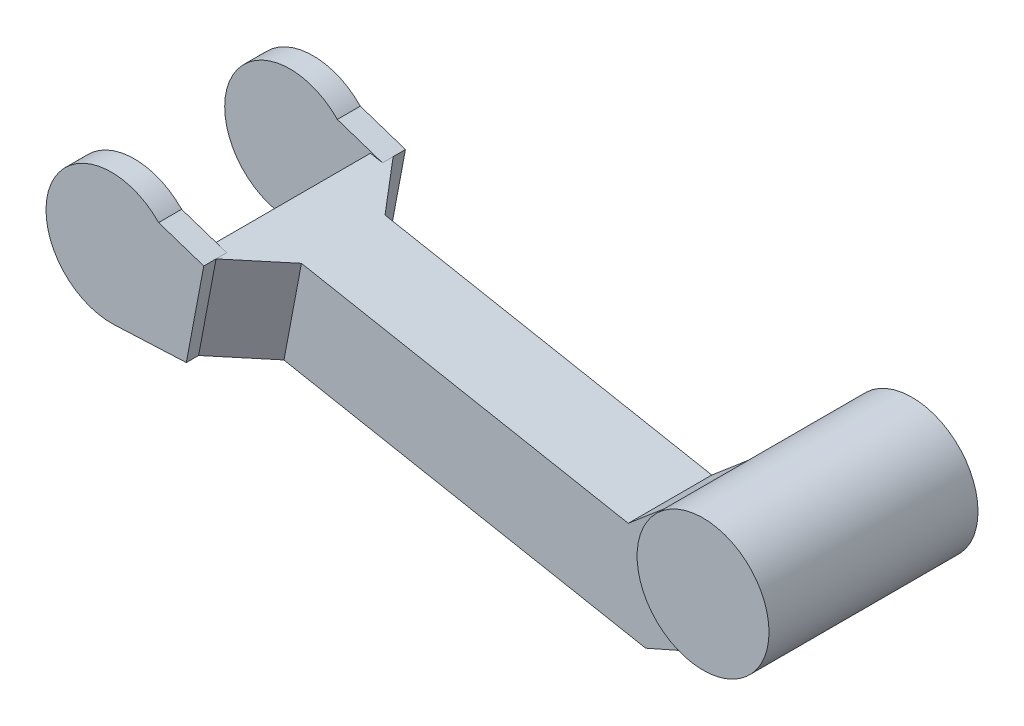
ISO-10303-21;
HEADER;
FILE_DESCRIPTION(('STEP AP214'),'2;1');
FILE_NAME('part.step','',(''),(''),'','','');
FILE_SCHEMA(('AUTOMOTIVE_DESIGN { 1 0 10303 214 1 1 1 1 }'));
ENDSEC;
DATA;
#1=APPLICATION_CONTEXT('core data for automotive mechanical design processes');
#2=APPLICATION_PROTOCOL_DEFINITION('international standard','automotive_design',2000,#1);
#3=PRODUCT_CONTEXT('',#1,'mechanical');
#4=PRODUCT('Part','Part','',(#3));
#5=PRODUCT_RELATED_PRODUCT_CATEGORY('part','',(#4));
#6=PRODUCT_DEFINITION_FORMATION('','',#4);
#7=PRODUCT_DEFINITION_CONTEXT('part definition',#1,'design');
#8=PRODUCT_DEFINITION('design','',#6,#7);
#9=PRODUCT_DEFINITION_SHAPE('','',#8);
#10=(LENGTH_UNIT() NAMED_UNIT(*) SI_UNIT(.MILLI.,.METRE.));
#11=(NAMED_UNIT(*) PLANE_ANGLE_UNIT() SI_UNIT($,.RADIAN.));
#12=(NAMED_UNIT(*) SI_UNIT($,.STERADIAN.) SOLID_ANGLE_UNIT());
#13=UNCERTAINTY_MEASURE_WITH_UNIT(LENGTH_MEASURE(1.E-05),#10,'distance_accuracy_value','');
#14=(GEOMETRIC_REPRESENTATION_CONTEXT(3) GLOBAL_UNCERTAINTY_ASSIGNED_CONTEXT((#13)) GLOBAL_UNIT_ASSIGNED_CONTEXT((#10,
#11,#12)) REPRESENTATION_CONTEXT('',''));
#15=CARTESIAN_POINT('',(0.,0.,0.));
#16=DIRECTION('',(0.,0.,1.));
#17=DIRECTION('',(1.,0.,0.));
#18=AXIS2_PLACEMENT_3D('',#15,#16,#17);
#19=CARTESIAN_POINT('',(0.219275504350662,-0.0185701753944159,-0.02));
#20=DIRECTION('',(0.185665007156138,0.982613100420359,0.));
#21=DIRECTION('',(-0.982613100420359,0.185665007156138,0.));
#22=AXIS2_PLACEMENT_3D('',#19,#20,#21);
#23=PLANE('',#22);
#24=DIRECTION('',(0.,0.,1.));
#25=VECTOR('',#24,1.);
#26=CARTESIAN_POINT('',(0.0441830210359381,0.0145135959838684,-0.0485));
#27=LINE('',#26,#25);
#28=CARTESIAN_POINT('',(0.0441830210359381,0.0145135959838684,-0.0425959256360464));
#29=VERTEX_POINT('',#28);
#30=CARTESIAN_POINT('',(0.0441830210359381,0.0145135959838684,-0.0375));
#31=VERTEX_POINT('',#30);
#32=EDGE_CURVE('E228',#29,#31,#27,.T.);
#33=ORIENTED_EDGE('',*,*,#32,.T.);
#34=DIRECTION('',(0.982613100420359,-0.185665007156138,0.));
#35=VECTOR('',#34,1.);
#36=CARTESIAN_POINT('',(0.219275504350662,-0.0185701753944159,-0.0375));
#37=LINE('',#36,#35);
#38=CARTESIAN_POINT('',(0.0384360985953204,0.0155994785103752,-0.0375));
#39=VERTEX_POINT('',#38);
#40=EDGE_CURVE('E231',#39,#31,#37,.T.);
#41=ORIENTED_EDGE('',*,*,#40,.F.);
#42=DIRECTION('',(0.,0.,1.));
#43=VECTOR('',#42,1.);
#44=CARTESIAN_POINT('',(0.0384360985953204,0.0155994785103752,-0.0425959256360464));
#45=LINE('',#44,#43);
#46=CARTESIAN_POINT('',(0.0384360985953207,0.0155994785103751,0.037));
#47=VERTEX_POINT('',#46);
#48=EDGE_CURVE('E62',#39,#47,#45,.T.);
#49=ORIENTED_EDGE('',*,*,#48,.T.);
#50=DIRECTION('',(0.982613100420359,-0.185665007156138,0.));
#51=VECTOR('',#50,1.);
#52=CARTESIAN_POINT('',(0.219275504350662,-0.0185701753944159,0.037));
#53=LINE('',#52,#51);
#54=CARTESIAN_POINT('',(0.0441830210359381,0.0145135959838684,0.037));
#55=VERTEX_POINT('',#54);
#56=EDGE_CURVE('E266',#47,#55,#53,.T.);
#57=ORIENTED_EDGE('',*,*,#56,.T.);
#58=DIRECTION('',(0.,0.,-1.));
#59=VECTOR('',#58,1.);
#60=CARTESIAN_POINT('',(0.0441830210359381,0.0145135959838684,0.048));
#61=LINE('',#60,#59);
#62=CARTESIAN_POINT('',(0.0441830210359381,0.0145135959838684,0.0421205313982931));
#63=VERTEX_POINT('',#62);
#64=EDGE_CURVE('E253',#63,#55,#61,.T.);
#65=ORIENTED_EDGE('',*,*,#64,.F.);
#66=DIRECTION('',(0.641493073190613,-0.12121028711463,-0.757492378407897));
#67=VECTOR('',#66,1.);
#68=CARTESIAN_POINT('',(0.0441830210359381,0.0145135959838684,0.0421205313982931));
#69=LINE('',#68,#67);
#70=CARTESIAN_POINT('',(0.062916104129296,0.010973974941673,0.02));
#71=VERTEX_POINT('',#70);
#72=EDGE_CURVE('E279',#63,#71,#69,.T.);
#73=ORIENTED_EDGE('',*,*,#72,.T.);
#74=DIRECTION('',(-0.982613100420359,0.185665007156138,0.));
#75=VECTOR('',#74,1.);
#76=CARTESIAN_POINT('',(0.219275504350662,-0.0185701753944159,0.02));
#77=LINE('',#76,#75);
#78=CARTESIAN_POINT('',(0.219275504350662,-0.0185701753944159,0.02));
#79=VERTEX_POINT('',#78);
#80=EDGE_CURVE('E305',#79,#71,#77,.T.);
#81=ORIENTED_EDGE('',*,*,#80,.F.);
#82=DIRECTION('',(0.,0.,1.));
#83=VECTOR('',#82,1.);
#84=CARTESIAN_POINT('',(0.219275504350662,-0.0185701753944159,-0.02));
#85=LINE('',#84,#83);
#86=CARTESIAN_POINT('',(0.219275504350662,-0.0185701753944159,-0.02));
#87=VERTEX_POINT('',#86);
#88=EDGE_CURVE('E346',#87,#79,#85,.T.);
#89=ORIENTED_EDGE('',*,*,#88,.F.);
#90=DIRECTION('',(-0.982613100420359,0.185665007156138,0.));
#91=VECTOR('',#90,1.);
#92=CARTESIAN_POINT('',(0.219275504350662,-0.0185701753944159,-0.02));
#93=LINE('',#92,#91);
#94=CARTESIAN_POINT('',(0.062916104129296,0.010973974941673,-0.02));
#95=VERTEX_POINT('',#94);
#96=EDGE_CURVE('E320',#87,#95,#93,.T.);
#97=ORIENTED_EDGE('',*,*,#96,.T.);
#98=DIRECTION('',(-0.633643962286851,0.119727195517853,-0.764304080658248));
#99=VECTOR('',#98,1.);
#100=CARTESIAN_POINT('',(0.062916104129296,0.010973974941673,-0.02));
#101=LINE('',#100,#99);
#102=EDGE_CURVE('E282',#95,#29,#101,.T.);
#103=ORIENTED_EDGE('',*,*,#102,.T.);
#104=EDGE_LOOP('',(#33,#41,#49,#57,#65,#73,#81,#89,#97,#103));
#105=FACE_BOUND('',#104,.T.);
#106=ADVANCED_FACE('F39',(#105),#23,.T.);
#107=CARTESIAN_POINT('',(-0.00418405553912482,-0.0221436868939603,0.));
#108=DIRECTION('',(0.185665007156138,0.982613100420359,0.));
#109=DIRECTION('',(-0.982613100420359,0.185665007156138,0.));
#110=AXIS2_PLACEMENT_3D('',#107,#108,#109);
#111=PLANE('',#110);
#112=DIRECTION('',(0.,0.,-1.));
#113=VECTOR('',#112,1.);
#114=CARTESIAN_POINT('',(0.0358280957139119,-0.0297039935350477,0.048));
#115=LINE('',#114,#113);
#116=CARTESIAN_POINT('',(0.0358280957139119,-0.0297039935350477,0.0421205313982931));
#117=VERTEX_POINT('',#116);
#118=CARTESIAN_POINT('',(0.0358280957139119,-0.0297039935350477,0.037));
#119=VERTEX_POINT('',#118);
#120=EDGE_CURVE('E257',#117,#119,#115,.T.);
#121=ORIENTED_EDGE('',*,*,#120,.T.);
#122=DIRECTION('',(0.982613100420359,-0.185665007156138,0.));
#123=VECTOR('',#122,1.);
#124=CARTESIAN_POINT('',(-0.00418405553912482,-0.0221436868939603,0.037));
#125=LINE('',#124,#123);
#126=CARTESIAN_POINT('',(0.0300811732732945,-0.0286181110085411,0.037));
#127=VERTEX_POINT('',#126);
#128=EDGE_CURVE('E264',#127,#119,#125,.T.);
#129=ORIENTED_EDGE('',*,*,#128,.F.);
#130=DIRECTION('',(0.,0.,1.));
#131=VECTOR('',#130,1.);
#132=CARTESIAN_POINT('',(0.0300811732732942,-0.028618111008541,-0.0425959256360464));
#133=LINE('',#132,#131);
#134=CARTESIAN_POINT('',(0.0300811732732942,-0.028618111008541,0.02));
#135=VERTEX_POINT('',#134);
#136=EDGE_CURVE('E271',#135,#127,#133,.T.);
#137=ORIENTED_EDGE('',*,*,#136,.F.);
#138=DIRECTION('',(0.982613100420359,-0.185665007156138,0.));
#139=VECTOR('',#138,1.);
#140=CARTESIAN_POINT('',(-0.00418405553912483,-0.0221436868939603,0.02));
#141=LINE('',#140,#139);
#142=CARTESIAN_POINT('',(0.0545611788072698,-0.0332436145772432,0.02));
#143=VERTEX_POINT('',#142);
#144=EDGE_CURVE('E360',#135,#143,#141,.T.);
#145=ORIENTED_EDGE('',*,*,#144,.T.);
#146=DIRECTION('',(0.641493073190613,-0.12121028711463,-0.757492378407897));
#147=VECTOR('',#146,1.);
#148=CARTESIAN_POINT('',(0.0358280957139119,-0.0297039935350477,0.0421205313982931));
#149=LINE('',#148,#147);
#150=EDGE_CURVE('E270',#117,#143,#149,.T.);
#151=ORIENTED_EDGE('',*,*,#150,.F.);
#152=EDGE_LOOP('',(#121,#129,#137,#145,#151));
#153=FACE_BOUND('',#152,.T.);
#154=ADVANCED_FACE('F387',(#153),#111,.F.);
#155=CARTESIAN_POINT('',(0.0300811732732942,-0.028618111008541,-0.0425959256360464));
#156=DIRECTION('',(-0.982613100420359,0.185665007156138,0.));
#157=DIRECTION('',(-0.185665007156138,-0.982613100420359,0.));
#158=AXIS2_PLACEMENT_3D('',#155,#156,#157);
#159=PLANE('',#158);
#160=DIRECTION('',(0.185665007156138,0.982613100420359,0.));
#161=VECTOR('',#160,1.);
#162=CARTESIAN_POINT('',(0.0300811732732942,-0.028618111008541,-0.0375));
#163=LINE('',#162,#161);
#164=CARTESIAN_POINT('',(0.0300811732732942,-0.028618111008541,-0.0375));
#165=VERTEX_POINT('',#164);
#166=EDGE_CURVE('E224',#165,#39,#163,.T.);
#167=ORIENTED_EDGE('',*,*,#166,.F.);
#168=CARTESIAN_POINT('',(0.0300811732732942,-0.028618111008541,-0.02));
#169=VERTEX_POINT('',#168);
#170=EDGE_CURVE('E268',#165,#169,#133,.T.);
#171=ORIENTED_EDGE('',*,*,#170,.T.);
#172=DIRECTION('',(0.185665007156138,0.982613100420359,0.));
#173=VECTOR('',#172,1.);
#174=CARTESIAN_POINT('',(0.0342652288124191,-0.00647442411458072,-0.02));
#175=LINE('',#174,#173);
#176=CARTESIAN_POINT('',(0.0347334988010987,-0.00399615299360829,-0.02));
#177=VERTEX_POINT('',#176);
#178=EDGE_CURVE('E299',#169,#177,#175,.T.);
#179=ORIENTED_EDGE('',*,*,#178,.T.);
#180=DIRECTION('',(0.,1.16305100130705E-13,1.));
#181=VECTOR('',#180,1.);
#182=CARTESIAN_POINT('',(0.0347334988010973,-0.00399615299361515,-0.0199999999999976));
#183=LINE('',#182,#181);
#184=CARTESIAN_POINT('',(0.0347334988011004,-0.00399615299360026,0.02));
#185=VERTEX_POINT('',#184);
#186=EDGE_CURVE('E296',#177,#185,#183,.T.);
#187=ORIENTED_EDGE('',*,*,#186,.T.);
#188=DIRECTION('',(0.185665007156138,0.982613100420359,0.));
#189=VECTOR('',#188,1.);
#190=CARTESIAN_POINT('',(0.0342652288124192,-0.00647442411458075,0.02));
#191=LINE('',#190,#189);
#192=EDGE_CURVE('E363',#135,#185,#191,.T.);
#193=ORIENTED_EDGE('',*,*,#192,.F.);
#194=ORIENTED_EDGE('',*,*,#136,.T.);
#195=DIRECTION('',(0.185665007156138,0.982613100420359,0.));
#196=VECTOR('',#195,1.);
#197=CARTESIAN_POINT('',(0.0300811732732945,-0.0286181110085411,0.037));
#198=LINE('',#197,#196);
#199=EDGE_CURVE('E365',#127,#47,#198,.T.);
#200=ORIENTED_EDGE('',*,*,#199,.T.);
#201=ORIENTED_EDGE('',*,*,#48,.F.);
#202=EDGE_LOOP('',(#167,#171,#179,#187,#193,#194,#200,#201));
#203=FACE_BOUND('',#202,.T.);
#204=ADVANCED_FACE('F376',(#203),#159,.T.);
#205=CARTESIAN_POINT('',(0.285082824963195,0.,-0.05));
#206=DIRECTION('',(0.,0.,1.));
#207=DIRECTION('',(1.,0.,0.));
#208=AXIS2_PLACEMENT_3D('',#205,#206,#207);
#209=CYLINDRICAL_SURFACE('',#208,0.03155548500995);
#210=CARTESIAN_POINT('',(0.285082824963195,0.,-0.02));
#211=DIRECTION('',(0.,0.,-1.));
#212=DIRECTION('',(-1.,0.,0.));
#213=AXIS2_PLACEMENT_3D('',#210,#211,#212);
#214=CIRCLE('',#213,0.03155548500995);
#215=CARTESIAN_POINT('',(0.256264100734639,0.0128541731765059,-0.02));
#216=VERTEX_POINT('',#215);
#217=CARTESIAN_POINT('',(0.305214711775595,-0.0242992956191301,-0.02));
#218=VERTEX_POINT('',#217);
#219=EDGE_CURVE('E358',#216,#218,#214,.F.);
#220=ORIENTED_EDGE('',*,*,#219,.F.);
#221=DIRECTION('',(0.,0.,1.));
#222=VECTOR('',#221,1.);
#223=CARTESIAN_POINT('',(0.256264100734639,0.0128541731765059,-0.02));
#224=LINE('',#223,#222);
#225=CARTESIAN_POINT('',(0.256264100734639,0.0128541731765059,0.02));
#226=VERTEX_POINT('',#225);
#227=EDGE_CURVE('E334',#216,#226,#224,.T.);
#228=ORIENTED_EDGE('',*,*,#227,.T.);
#229=CARTESIAN_POINT('',(0.285082824963195,0.,0.02));
#230=DIRECTION('',(0.,0.,-1.));
#231=DIRECTION('',(-1.,0.,0.));
#232=AXIS2_PLACEMENT_3D('',#229,#230,#231);
#233=CIRCLE('',#232,0.03155548500995);
#234=CARTESIAN_POINT('',(0.305214711775595,-0.0242992956191301,0.02));
#235=VERTEX_POINT('',#234);
#236=EDGE_CURVE('E355',#226,#235,#233,.F.);
#237=ORIENTED_EDGE('',*,*,#236,.T.);
#238=DIRECTION('',(0.,0.,1.));
#239=VECTOR('',#238,1.);
#240=CARTESIAN_POINT('',(0.305214711775595,-0.0242992956191301,-0.02));
#241=LINE('',#240,#239);
#242=EDGE_CURVE('E335',#218,#235,#241,.T.);
#243=ORIENTED_EDGE('',*,*,#242,.F.);
#244=EDGE_LOOP('',(#220,#228,#237,#243));
#245=FACE_BOUND('',#244,.T.);
#246=CARTESIAN_POINT('',(0.285082824963195,0.,-0.05));
#247=DIRECTION('',(0.,0.,1.));
#248=DIRECTION('',(1.,0.,0.));
#249=AXIS2_PLACEMENT_3D('',#246,#247,#248);
#250=CIRCLE('',#249,0.03155548500995);
#251=CARTESIAN_POINT('',(0.316638309973145,0.,-0.05));
#252=VERTEX_POINT('',#251);
#253=EDGE_CURVE('E352',#252,#252,#250,.T.);
#254=ORIENTED_EDGE('',*,*,#253,.T.);
#255=EDGE_LOOP('',(#254));
#256=FACE_BOUND('',#255,.T.);
#257=CARTESIAN_POINT('',(0.285082824963195,0.,0.05));
#258=DIRECTION('',(0.,0.,1.));
#259=DIRECTION('',(1.,0.,0.));
#260=AXIS2_PLACEMENT_3D('',#257,#258,#259);
#261=CIRCLE('',#260,0.03155548500995);
#262=CARTESIAN_POINT('',(0.316638309973145,0.,0.05));
#263=VERTEX_POINT('',#262);
#264=EDGE_CURVE('E338',#263,#263,#261,.T.);
#265=ORIENTED_EDGE('',*,*,#264,.F.);
#266=EDGE_LOOP('',(#265));
#267=FACE_BOUND('',#266,.T.);
#268=ADVANCED_FACE('F41',(#245,#256,#267),#209,.T.);
#269=CARTESIAN_POINT('',(0.285082824963195,0.,-0.05));
#270=DIRECTION('',(0.,0.,1.));
#271=DIRECTION('',(1.,0.,0.));
#272=AXIS2_PLACEMENT_3D('',#269,#270,#271);
#273=PLANE('',#272);
#274=ORIENTED_EDGE('',*,*,#253,.F.);
#275=EDGE_LOOP('',(#274));
#276=FACE_BOUND('',#275,.T.);
#277=ADVANCED_FACE('F442',(#276),#273,.F.);
#278=CARTESIAN_POINT('',(0.285082824963195,0.,0.05));
#279=DIRECTION('',(0.,0.,1.));
#280=DIRECTION('',(1.,0.,0.));
#281=AXIS2_PLACEMENT_3D('',#278,#279,#280);
#282=PLANE('',#281);
#283=ORIENTED_EDGE('',*,*,#264,.T.);
#284=EDGE_LOOP('',(#283));
#285=FACE_BOUND('',#284,.T.);
#286=ADVANCED_FACE('F439',(#285),#282,.T.);
#287=CARTESIAN_POINT('',(0.289916370198147,-0.0386472936572409,-0.02));
#288=DIRECTION('',(0.684088364534501,-0.729399142793924,0.));
#289=DIRECTION('',(0.729399142793924,0.684088364534501,0.));
#290=AXIS2_PLACEMENT_3D('',#287,#288,#289);
#291=PLANE('',#290);
#292=ORIENTED_EDGE('',*,*,#242,.T.);
#293=DIRECTION('',(0.729399142793924,0.684088364534501,0.));
#294=VECTOR('',#293,1.);
#295=CARTESIAN_POINT('',(0.289916370198147,-0.0386472936572409,0.02));
#296=LINE('',#295,#294);
#297=CARTESIAN_POINT('',(0.289916370198147,-0.0386472936572409,0.02));
#298=VERTEX_POINT('',#297);
#299=EDGE_CURVE('E315',#298,#235,#296,.T.);
#300=ORIENTED_EDGE('',*,*,#299,.F.);
#301=DIRECTION('',(0.,0.,1.));
#302=VECTOR('',#301,1.);
#303=CARTESIAN_POINT('',(0.289916370198147,-0.0386472936572409,-0.02));
#304=LINE('',#303,#302);
#305=CARTESIAN_POINT('',(0.289916370198147,-0.0386472936572409,-0.02));
#306=VERTEX_POINT('',#305);
#307=EDGE_CURVE('E339',#306,#298,#304,.T.);
#308=ORIENTED_EDGE('',*,*,#307,.F.);
#309=DIRECTION('',(0.729399142793924,0.684088364534501,0.));
#310=VECTOR('',#309,1.);
#311=CARTESIAN_POINT('',(0.289916370198147,-0.0386472936572409,-0.02));
#312=LINE('',#311,#310);
#313=EDGE_CURVE('E331',#306,#218,#312,.T.);
#314=ORIENTED_EDGE('',*,*,#313,.T.);
#315=EDGE_LOOP('',(#292,#300,#308,#314));
#316=FACE_BOUND('',#315,.T.);
#317=ADVANCED_FACE('F441',(#316),#291,.T.);
#318=CARTESIAN_POINT('',(0.227597753311921,-0.0661558631230026,-0.02));
#319=DIRECTION('',(0.403825283971737,-0.914836127415804,0.));
#320=DIRECTION('',(0.914836127415805,0.403825283971737,0.));
#321=AXIS2_PLACEMENT_3D('',#318,#319,#320);
#322=PLANE('',#321);
#323=ORIENTED_EDGE('',*,*,#307,.T.);
#324=DIRECTION('',(0.914836127415804,0.403825283971737,0.));
#325=VECTOR('',#324,1.);
#326=CARTESIAN_POINT('',(0.227597753311921,-0.0661558631230026,0.02));
#327=LINE('',#326,#325);
#328=CARTESIAN_POINT('',(0.227597753311921,-0.0661558631230026,0.02));
#329=VERTEX_POINT('',#328);
#330=EDGE_CURVE('E312',#329,#298,#327,.T.);
#331=ORIENTED_EDGE('',*,*,#330,.F.);
#332=DIRECTION('',(0.,0.,1.));
#333=VECTOR('',#332,1.);
#334=CARTESIAN_POINT('',(0.227597753311921,-0.0661558631230026,-0.02));
#335=LINE('',#334,#333);
#336=CARTESIAN_POINT('',(0.227597753311921,-0.0661558631230026,-0.02));
#337=VERTEX_POINT('',#336);
#338=EDGE_CURVE('E341',#337,#329,#335,.T.);
#339=ORIENTED_EDGE('',*,*,#338,.F.);
#340=DIRECTION('',(0.914836127415804,0.403825283971737,0.));
#341=VECTOR('',#340,1.);
#342=CARTESIAN_POINT('',(0.227597753311921,-0.0661558631230026,-0.02));
#343=LINE('',#342,#341);
#344=EDGE_CURVE('E328',#337,#306,#343,.T.);
#345=ORIENTED_EDGE('',*,*,#344,.T.);
#346=EDGE_LOOP('',(#323,#331,#339,#345));
#347=FACE_BOUND('',#346,.T.);
#348=ADVANCED_FACE('F469',(#347),#322,.T.);
#349=CARTESIAN_POINT('',(0.0293620855256194,-0.0285371730406325,-0.02));
#350=DIRECTION('',(-0.186440190809526,-0.982466312527258,0.));
#351=DIRECTION('',(0.982466312527258,-0.186440190809526,0.));
#352=AXIS2_PLACEMENT_3D('',#349,#350,#351);
#353=PLANE('',#352);
#354=ORIENTED_EDGE('',*,*,#338,.T.);
#355=DIRECTION('',(0.982466312527258,-0.186440190809526,0.));
#356=VECTOR('',#355,1.);
#357=CARTESIAN_POINT('',(0.0293620855256194,-0.0285371730406325,0.02));
#358=LINE('',#357,#356);
#359=CARTESIAN_POINT('',(0.0293620855256194,-0.0285371730406325,0.02));
#360=VERTEX_POINT('',#359);
#361=EDGE_CURVE('E309',#360,#329,#358,.T.);
#362=ORIENTED_EDGE('',*,*,#361,.F.);
#363=DIRECTION('',(0.,0.,1.));
#364=VECTOR('',#363,1.);
#365=CARTESIAN_POINT('',(0.0293620855256194,-0.0285371730406325,-0.02));
#366=LINE('',#365,#364);
#367=CARTESIAN_POINT('',(0.0293620855256194,-0.0285371730406325,-0.02));
#368=VERTEX_POINT('',#367);
#369=EDGE_CURVE('E343',#368,#360,#366,.T.);
#370=ORIENTED_EDGE('',*,*,#369,.F.);
#371=DIRECTION('',(0.982466312527258,-0.186440190809526,0.));
#372=VECTOR('',#371,1.);
#373=CARTESIAN_POINT('',(0.0293620855256194,-0.0285371730406325,-0.02));
#374=LINE('',#373,#372);
#375=EDGE_CURVE('E325',#368,#337,#374,.T.);
#376=ORIENTED_EDGE('',*,*,#375,.T.);
#377=EDGE_LOOP('',(#354,#362,#370,#376));
#378=FACE_BOUND('',#377,.T.);
#379=ADVANCED_FACE('F474',(#378),#353,.T.);
#380=CARTESIAN_POINT('',(0.0389992026637032,0.0154930798466069,-0.02));
#381=DIRECTION('',(-0.976874539525971,0.213813315829304,0.));
#382=DIRECTION('',(-0.213813315829304,-0.976874539525971,0.));
#383=AXIS2_PLACEMENT_3D('',#380,#381,#382);
#384=PLANE('',#383);
#385=ORIENTED_EDGE('',*,*,#186,.F.);
#386=DIRECTION('',(-0.213813315829304,-0.976874539525971,0.));
#387=VECTOR('',#386,1.);
#388=CARTESIAN_POINT('',(0.0389992026637032,0.0154930798466069,-0.02));
#389=LINE('',#388,#387);
#390=EDGE_CURVE('E323',#177,#368,#389,.T.);
#391=ORIENTED_EDGE('',*,*,#390,.T.);
#392=ORIENTED_EDGE('',*,*,#369,.T.);
#393=DIRECTION('',(-0.213813315829304,-0.976874539525971,0.));
#394=VECTOR('',#393,1.);
#395=CARTESIAN_POINT('',(0.0389992026637032,0.0154930798466069,0.02));
#396=LINE('',#395,#394);
#397=EDGE_CURVE('E307',#185,#360,#396,.T.);
#398=ORIENTED_EDGE('',*,*,#397,.F.);
#399=EDGE_LOOP('',(#385,#391,#392,#398));
#400=FACE_BOUND('',#399,.T.);
#401=ADVANCED_FACE('F432',(#400),#384,.T.);
#402=CARTESIAN_POINT('',(0.256264100734639,0.0128541731765059,-0.02));
#403=DIRECTION('',(-0.647457513851139,0.762101546880533,0.));
#404=DIRECTION('',(-0.762101546880533,-0.647457513851139,0.));
#405=AXIS2_PLACEMENT_3D('',#402,#403,#404);
#406=PLANE('',#405);
#407=ORIENTED_EDGE('',*,*,#88,.T.);
#408=DIRECTION('',(-0.762101546880533,-0.647457513851139,0.));
#409=VECTOR('',#408,1.);
#410=CARTESIAN_POINT('',(0.256264100734639,0.0128541731765059,0.02));
#411=LINE('',#410,#409);
#412=EDGE_CURVE('E302',#226,#79,#411,.T.);
#413=ORIENTED_EDGE('',*,*,#412,.F.);
#414=ORIENTED_EDGE('',*,*,#227,.F.);
#415=DIRECTION('',(-0.762101546880533,-0.647457513851139,0.));
#416=VECTOR('',#415,1.);
#417=CARTESIAN_POINT('',(0.256264100734639,0.0128541731765059,-0.02));
#418=LINE('',#417,#416);
#419=EDGE_CURVE('E317',#216,#87,#418,.T.);
#420=ORIENTED_EDGE('',*,*,#419,.T.);
#421=EDGE_LOOP('',(#407,#413,#414,#420));
#422=FACE_BOUND('',#421,.T.);
#423=ADVANCED_FACE('F434',(#422),#406,.T.);
#424=CARTESIAN_POINT('',(0.,0.,-0.02));
#425=DIRECTION('',(0.,0.,-1.));
#426=DIRECTION('',(-1.,0.,0.));
#427=AXIS2_PLACEMENT_3D('',#424,#425,#426);
#428=PLANE('',#427);
#429=DIRECTION('',(0.185665007156138,0.982613100420359,0.));
#430=VECTOR('',#429,1.);
#431=CARTESIAN_POINT('',(0.0545611788072698,-0.0332436145772432,-0.02));
#432=LINE('',#431,#430);
#433=CARTESIAN_POINT('',(0.0545611788072698,-0.0332436145772432,-0.02));
#434=VERTEX_POINT('',#433);
#435=EDGE_CURVE('E289',#434,#95,#432,.T.);
#436=ORIENTED_EDGE('',*,*,#435,.T.);
#437=ORIENTED_EDGE('',*,*,#96,.F.);
#438=ORIENTED_EDGE('',*,*,#419,.F.);
#439=ORIENTED_EDGE('',*,*,#219,.T.);
#440=ORIENTED_EDGE('',*,*,#313,.F.);
#441=ORIENTED_EDGE('',*,*,#344,.F.);
#442=ORIENTED_EDGE('',*,*,#375,.F.);
#443=ORIENTED_EDGE('',*,*,#390,.F.);
#444=ORIENTED_EDGE('',*,*,#178,.F.);
#445=DIRECTION('',(0.982613100420359,-0.185665007156138,0.));
#446=VECTOR('',#445,1.);
#447=CARTESIAN_POINT('',(-0.00418405553912483,-0.0221436868939603,-0.02));
#448=LINE('',#447,#446);
#449=EDGE_CURVE('E288',#169,#434,#448,.T.);
#450=ORIENTED_EDGE('',*,*,#449,.T.);
#451=EDGE_LOOP('',(#436,#437,#438,#439,#440,#441,#442,#443,#444,#450));
#452=FACE_BOUND('',#451,.T.);
#453=ADVANCED_FACE('F437',(#452),#428,.T.);
#454=CARTESIAN_POINT('',(0.,0.,0.02));
#455=DIRECTION('',(0.,0.,-1.));
#456=DIRECTION('',(-1.,0.,0.));
#457=AXIS2_PLACEMENT_3D('',#454,#455,#456);
#458=PLANE('',#457);
#459=ORIENTED_EDGE('',*,*,#80,.T.);
#460=DIRECTION('',(0.185665007156138,0.982613100420359,0.));
#461=VECTOR('',#460,1.);
#462=CARTESIAN_POINT('',(0.0545611788072698,-0.0332436145772432,0.02));
#463=LINE('',#462,#461);
#464=EDGE_CURVE('E291',#143,#71,#463,.T.);
#465=ORIENTED_EDGE('',*,*,#464,.F.);
#466=ORIENTED_EDGE('',*,*,#144,.F.);
#467=ORIENTED_EDGE('',*,*,#192,.T.);
#468=ORIENTED_EDGE('',*,*,#397,.T.);
#469=ORIENTED_EDGE('',*,*,#361,.T.);
#470=ORIENTED_EDGE('',*,*,#330,.T.);
#471=ORIENTED_EDGE('',*,*,#299,.T.);
#472=ORIENTED_EDGE('',*,*,#236,.F.);
#473=ORIENTED_EDGE('',*,*,#412,.T.);
#474=EDGE_LOOP('',(#459,#465,#466,#467,#468,#469,#470,#471,#472,#473));
#475=FACE_BOUND('',#474,.T.);
#476=ADVANCED_FACE('F479',(#475),#458,.F.);
#477=CARTESIAN_POINT('',(0.0545611788072698,-0.0332436145772432,-0.02));
#478=DIRECTION('',(0.751015202359533,-0.141904522604879,-0.644856008957931));
#479=DIRECTION('',(-0.651448439438395,0.,-0.758692909386452));
#480=AXIS2_PLACEMENT_3D('',#477,#478,#479);
#481=PLANE('',#480);
#482=ORIENTED_EDGE('',*,*,#102,.F.);
#483=ORIENTED_EDGE('',*,*,#435,.F.);
#484=DIRECTION('',(-0.633643962286851,0.119727195517853,-0.764304080658248));
#485=VECTOR('',#484,1.);
#486=CARTESIAN_POINT('',(0.0545611788072698,-0.0332436145772432,-0.02));
#487=LINE('',#486,#485);
#488=CARTESIAN_POINT('',(0.0358280957139119,-0.0297039935350477,-0.0425959256360464));
#489=VERTEX_POINT('',#488);
#490=EDGE_CURVE('E274',#434,#489,#487,.T.);
#491=ORIENTED_EDGE('',*,*,#490,.T.);
#492=DIRECTION('',(0.185665007156138,0.982613100420359,0.));
#493=VECTOR('',#492,1.);
#494=CARTESIAN_POINT('',(0.0358280957139119,-0.0297039935350477,-0.0425959256360464));
#495=LINE('',#494,#493);
#496=EDGE_CURVE('E285',#489,#29,#495,.T.);
#497=ORIENTED_EDGE('',*,*,#496,.T.);
#498=EDGE_LOOP('',(#482,#483,#491,#497));
#499=FACE_BOUND('',#498,.T.);
#500=ADVANCED_FACE('F484',(#499),#481,.T.);
#501=CARTESIAN_POINT('',(0.0358280957139119,-0.0297039935350477,0.0421205313982931));
#502=DIRECTION('',(0.744321934492175,-0.140639827857822,0.652844006370548));
#503=DIRECTION('',(0.659397876722298,0.,-0.751794147472648));
#504=AXIS2_PLACEMENT_3D('',#501,#502,#503);
#505=PLANE('',#504);
#506=ORIENTED_EDGE('',*,*,#72,.F.);
#507=DIRECTION('',(0.185665007156138,0.982613100420359,0.));
#508=VECTOR('',#507,1.);
#509=CARTESIAN_POINT('',(0.0358280957139119,-0.0297039935350477,0.0421205313982931));
#510=LINE('',#509,#508);
#511=EDGE_CURVE('E277',#117,#63,#510,.T.);
#512=ORIENTED_EDGE('',*,*,#511,.F.);
#513=ORIENTED_EDGE('',*,*,#150,.T.);
#514=ORIENTED_EDGE('',*,*,#464,.T.);
#515=EDGE_LOOP('',(#506,#512,#513,#514));
#516=FACE_BOUND('',#515,.T.);
#517=ADVANCED_FACE('F399',(#516),#505,.T.);
#518=DIRECTION('',(0.982613100420359,-0.185665007156138,0.));
#519=VECTOR('',#518,1.);
#520=CARTESIAN_POINT('',(-0.00418405553912482,-0.0221436868939603,-0.0375));
#521=LINE('',#520,#519);
#522=CARTESIAN_POINT('',(0.0358280957139119,-0.0297039935350477,-0.0375));
#523=VERTEX_POINT('',#522);
#524=EDGE_CURVE('E47',#165,#523,#521,.T.);
#525=ORIENTED_EDGE('',*,*,#524,.T.);
#526=DIRECTION('',(0.,0.,-1.));
#527=VECTOR('',#526,1.);
#528=CARTESIAN_POINT('',(0.0358280957139119,-0.0297039935350477,0.));
#529=LINE('',#528,#527);
#530=EDGE_CURVE('E11',#523,#489,#529,.T.);
#531=ORIENTED_EDGE('',*,*,#530,.T.);
#532=ORIENTED_EDGE('',*,*,#490,.F.);
#533=ORIENTED_EDGE('',*,*,#449,.F.);
#534=ORIENTED_EDGE('',*,*,#170,.F.);
#535=EDGE_LOOP('',(#525,#531,#532,#533,#534));
#536=FACE_BOUND('',#535,.T.);
#537=ADVANCED_FACE('F370',(#536),#111,.F.);
#538=CARTESIAN_POINT('',(0.,0.,0.048));
#539=DIRECTION('',(0.,0.,-1.));
#540=DIRECTION('',(-1.,0.,0.));
#541=AXIS2_PLACEMENT_3D('',#538,#539,#540);
#542=CYLINDRICAL_SURFACE('',#541,0.0313133955941788);
#543=CARTESIAN_POINT('',(0.,0.,0.037));
#544=DIRECTION('',(0.,0.,1.));
#545=DIRECTION('',(1.,0.,0.));
#546=AXIS2_PLACEMENT_3D('',#543,#544,#545);
#547=CIRCLE('',#546,0.0313133955941788);
#548=CARTESIAN_POINT('',(0.0225796423819886,0.0216953564971641,0.037));
#549=VERTEX_POINT('',#548);
#550=CARTESIAN_POINT('',(0.0014338316955376,-0.0312805509910936,0.037));
#551=VERTEX_POINT('',#550);
#552=EDGE_CURVE('E233',#549,#551,#547,.T.);
#553=ORIENTED_EDGE('',*,*,#552,.T.);
#554=DIRECTION('',(0.,0.,-1.));
#555=VECTOR('',#554,1.);
#556=CARTESIAN_POINT('',(0.0014338316955376,-0.0312805509910936,0.048));
#557=LINE('',#556,#555);
#558=CARTESIAN_POINT('',(0.0014338316955376,-0.0312805509910936,0.048));
#559=VERTEX_POINT('',#558);
#560=EDGE_CURVE('E261',#559,#551,#557,.T.);
#561=ORIENTED_EDGE('',*,*,#560,.F.);
#562=CARTESIAN_POINT('',(0.,0.,0.048));
#563=DIRECTION('',(0.,0.,1.));
#564=DIRECTION('',(1.,0.,0.));
#565=AXIS2_PLACEMENT_3D('',#562,#563,#564);
#566=CIRCLE('',#565,0.0313133955941788);
#567=CARTESIAN_POINT('',(0.0225796423819886,0.0216953564971641,0.048));
#568=VERTEX_POINT('',#567);
#569=EDGE_CURVE('E234',#568,#559,#566,.T.);
#570=ORIENTED_EDGE('',*,*,#569,.F.);
#571=DIRECTION('',(0.,0.,-1.));
#572=VECTOR('',#571,1.);
#573=CARTESIAN_POINT('',(0.0225796423819886,0.0216953564971641,0.048));
#574=LINE('',#573,#572);
#575=EDGE_CURVE('E244',#568,#549,#574,.T.);
#576=ORIENTED_EDGE('',*,*,#575,.T.);
#577=EDGE_LOOP('',(#553,#561,#570,#576));
#578=FACE_BOUND('',#577,.T.);
#579=ADVANCED_FACE('F410',(#578),#542,.T.);
#580=CARTESIAN_POINT('',(0.0014338316955376,-0.0312805509910936,0.048));
#581=DIRECTION('',(-0.0457897225238691,0.998951100560577,0.));
#582=DIRECTION('',(-0.998951100560577,-0.0457897225238691,0.));
#583=AXIS2_PLACEMENT_3D('',#580,#581,#582);
#584=PLANE('',#583);
#585=DIRECTION('',(0.998951100560576,0.0457897225238691,0.));
#586=VECTOR('',#585,1.);
#587=CARTESIAN_POINT('',(0.0014338316955376,-0.0312805509910936,0.037));
#588=LINE('',#587,#586);
#589=EDGE_CURVE('E247',#551,#119,#588,.T.);
#590=ORIENTED_EDGE('',*,*,#589,.T.);
#591=ORIENTED_EDGE('',*,*,#120,.F.);
#592=CARTESIAN_POINT('',(0.0358280957139119,-0.0297039935350477,0.048));
#593=VERTEX_POINT('',#592);
#594=EDGE_CURVE('E258',#593,#117,#115,.T.);
#595=ORIENTED_EDGE('',*,*,#594,.F.);
#596=DIRECTION('',(0.998951100560576,0.0457897225238691,0.));
#597=VECTOR('',#596,1.);
#598=CARTESIAN_POINT('',(0.0014338316955376,-0.0312805509910936,0.048));
#599=LINE('',#598,#597);
#600=EDGE_CURVE('E237',#559,#593,#599,.T.);
#601=ORIENTED_EDGE('',*,*,#600,.F.);
#602=ORIENTED_EDGE('',*,*,#560,.T.);
#603=EDGE_LOOP('',(#590,#591,#595,#601,#602));
#604=FACE_BOUND('',#603,.T.);
#605=ADVANCED_FACE('F391',(#604),#584,.F.);
#606=CARTESIAN_POINT('',(0.0358280957139119,-0.0297039935350477,0.048));
#607=DIRECTION('',(-0.982613100420359,0.185665007156138,0.));
#608=DIRECTION('',(-0.185665007156138,-0.982613100420359,0.));
#609=AXIS2_PLACEMENT_3D('',#606,#607,#608);
#610=PLANE('',#609);
#611=ORIENTED_EDGE('',*,*,#511,.T.);
#612=CARTESIAN_POINT('',(0.0441830210359381,0.0145135959838684,0.048));
#613=VERTEX_POINT('',#612);
#614=EDGE_CURVE('E254',#613,#63,#61,.T.);
#615=ORIENTED_EDGE('',*,*,#614,.F.);
#616=DIRECTION('',(0.185665007156138,0.982613100420359,0.));
#617=VECTOR('',#616,1.);
#618=CARTESIAN_POINT('',(0.0358280957139119,-0.0297039935350477,0.048));
#619=LINE('',#618,#617);
#620=EDGE_CURVE('E240',#593,#613,#619,.T.);
#621=ORIENTED_EDGE('',*,*,#620,.F.);
#622=ORIENTED_EDGE('',*,*,#594,.T.);
#623=EDGE_LOOP('',(#611,#615,#621,#622));
#624=FACE_BOUND('',#623,.T.);
#625=ADVANCED_FACE('F395',(#624),#610,.F.);
#626=CARTESIAN_POINT('',(0.0441830210359381,0.0145135959838684,0.048));
#627=DIRECTION('',(-0.315462080439013,-0.948938183342355,0.));
#628=DIRECTION('',(0.948938183342356,-0.315462080439013,0.));
#629=AXIS2_PLACEMENT_3D('',#626,#627,#628);
#630=PLANE('',#629);
#631=DIRECTION('',(-0.948938183342355,0.315462080439013,0.));
#632=VECTOR('',#631,1.);
#633=CARTESIAN_POINT('',(0.0441830210359381,0.0145135959838684,0.037));
#634=LINE('',#633,#632);
#635=EDGE_CURVE('E238',#55,#549,#634,.T.);
#636=ORIENTED_EDGE('',*,*,#635,.T.);
#637=ORIENTED_EDGE('',*,*,#575,.F.);
#638=DIRECTION('',(-0.948938183342355,0.315462080439013,0.));
#639=VECTOR('',#638,1.);
#640=CARTESIAN_POINT('',(0.0441830210359381,0.0145135959838684,0.048));
#641=LINE('',#640,#639);
#642=EDGE_CURVE('E242',#613,#568,#641,.T.);
#643=ORIENTED_EDGE('',*,*,#642,.F.);
#644=ORIENTED_EDGE('',*,*,#614,.T.);
#645=ORIENTED_EDGE('',*,*,#64,.T.);
#646=EDGE_LOOP('',(#636,#637,#643,#644,#645));
#647=FACE_BOUND('',#646,.T.);
#648=ADVANCED_FACE('F404',(#647),#630,.F.);
#649=CARTESIAN_POINT('',(0.,0.,0.048));
#650=DIRECTION('',(0.,0.,1.));
#651=DIRECTION('',(1.,0.,0.));
#652=AXIS2_PLACEMENT_3D('',#649,#650,#651);
#653=PLANE('',#652);
#654=ORIENTED_EDGE('',*,*,#569,.T.);
#655=ORIENTED_EDGE('',*,*,#600,.T.);
#656=ORIENTED_EDGE('',*,*,#620,.T.);
#657=ORIENTED_EDGE('',*,*,#642,.T.);
#658=EDGE_LOOP('',(#654,#655,#656,#657));
#659=FACE_BOUND('',#658,.T.);
#660=ADVANCED_FACE('F413',(#659),#653,.T.);
#661=CARTESIAN_POINT('',(0.,0.,0.037));
#662=DIRECTION('',(0.,0.,1.));
#663=DIRECTION('',(1.,0.,0.));
#664=AXIS2_PLACEMENT_3D('',#661,#662,#663);
#665=PLANE('',#664);
#666=ORIENTED_EDGE('',*,*,#56,.F.);
#667=ORIENTED_EDGE('',*,*,#199,.F.);
#668=ORIENTED_EDGE('',*,*,#128,.T.);
#669=ORIENTED_EDGE('',*,*,#589,.F.);
#670=ORIENTED_EDGE('',*,*,#552,.F.);
#671=ORIENTED_EDGE('',*,*,#635,.F.);
#672=EDGE_LOOP('',(#666,#667,#668,#669,#670,#671));
#673=FACE_BOUND('',#672,.T.);
#674=ADVANCED_FACE('F383',(#673),#665,.F.);
#675=CARTESIAN_POINT('',(0.,0.,-0.0485));
#676=DIRECTION('',(0.,0.,1.));
#677=DIRECTION('',(1.,0.,0.));
#678=AXIS2_PLACEMENT_3D('',#675,#676,#677);
#679=CYLINDRICAL_SURFACE('',#678,0.0313133955941788);
#680=CARTESIAN_POINT('',(0.,0.,-0.0375));
#681=DIRECTION('',(0.,0.,1.));
#682=DIRECTION('',(1.,0.,0.));
#683=AXIS2_PLACEMENT_3D('',#680,#681,#682);
#684=CIRCLE('',#683,0.0313133955941788);
#685=CARTESIAN_POINT('',(0.0225796423819886,0.0216953564971641,-0.0375));
#686=VERTEX_POINT('',#685);
#687=CARTESIAN_POINT('',(0.0014338316955376,-0.0312805509910936,-0.0375));
#688=VERTEX_POINT('',#687);
#689=EDGE_CURVE('E220',#686,#688,#684,.T.);
#690=ORIENTED_EDGE('',*,*,#689,.F.);
#691=DIRECTION('',(0.,0.,1.));
#692=VECTOR('',#691,1.);
#693=CARTESIAN_POINT('',(0.0225796423819886,0.0216953564971641,-0.0485));
#694=LINE('',#693,#692);
#695=CARTESIAN_POINT('',(0.0225796423819886,0.0216953564971641,-0.0485));
#696=VERTEX_POINT('',#695);
#697=EDGE_CURVE('E212',#696,#686,#694,.T.);
#698=ORIENTED_EDGE('',*,*,#697,.F.);
#699=CARTESIAN_POINT('',(0.,0.,-0.0485));
#700=DIRECTION('',(0.,0.,1.));
#701=DIRECTION('',(1.,0.,0.));
#702=AXIS2_PLACEMENT_3D('',#699,#700,#701);
#703=CIRCLE('',#702,0.0313133955941788);
#704=CARTESIAN_POINT('',(0.0014338316955376,-0.0312805509910936,-0.0485));
#705=VERTEX_POINT('',#704);
#706=EDGE_CURVE('E206',#696,#705,#703,.T.);
#707=ORIENTED_EDGE('',*,*,#706,.T.);
#708=DIRECTION('',(0.,0.,1.));
#709=VECTOR('',#708,1.);
#710=CARTESIAN_POINT('',(0.0014338316955376,-0.0312805509910936,-0.0485));
#711=LINE('',#710,#709);
#712=EDGE_CURVE('E190',#705,#688,#711,.T.);
#713=ORIENTED_EDGE('',*,*,#712,.T.);
#714=EDGE_LOOP('',(#690,#698,#707,#713));
#715=FACE_BOUND('',#714,.T.);
#716=ADVANCED_FACE('F211',(#715),#679,.T.);
#717=CARTESIAN_POINT('',(0.0441830210359381,0.0145135959838684,-0.0485));
#718=DIRECTION('',(0.315462080439013,0.948938183342355,0.));
#719=DIRECTION('',(-0.948938183342356,0.315462080439013,0.));
#720=AXIS2_PLACEMENT_3D('',#717,#718,#719);
#721=PLANE('',#720);
#722=DIRECTION('',(-0.948938183342355,0.315462080439013,0.));
#723=VECTOR('',#722,1.);
#724=CARTESIAN_POINT('',(0.0441830210359381,0.0145135959838684,-0.0375));
#725=LINE('',#724,#723);
#726=EDGE_CURVE('E213',#31,#686,#725,.T.);
#727=ORIENTED_EDGE('',*,*,#726,.F.);
#728=ORIENTED_EDGE('',*,*,#32,.F.);
#729=CARTESIAN_POINT('',(0.0441830210359381,0.0145135959838684,-0.0485));
#730=VERTEX_POINT('',#729);
#731=EDGE_CURVE('E225',#730,#29,#27,.T.);
#732=ORIENTED_EDGE('',*,*,#731,.F.);
#733=DIRECTION('',(-0.948938183342355,0.315462080439013,0.));
#734=VECTOR('',#733,1.);
#735=CARTESIAN_POINT('',(0.0441830210359381,0.0145135959838684,-0.0485));
#736=LINE('',#735,#734);
#737=EDGE_CURVE('E199',#730,#696,#736,.T.);
#738=ORIENTED_EDGE('',*,*,#737,.T.);
#739=ORIENTED_EDGE('',*,*,#697,.T.);
#740=EDGE_LOOP('',(#727,#728,#732,#738,#739));
#741=FACE_BOUND('',#740,.T.);
#742=ADVANCED_FACE('F487',(#741),#721,.T.);
#743=CARTESIAN_POINT('',(0.0358280957139119,-0.0297039935350477,-0.0485));
#744=DIRECTION('',(0.982613100420359,-0.185665007156138,0.));
#745=DIRECTION('',(0.185665007156138,0.982613100420359,0.));
#746=AXIS2_PLACEMENT_3D('',#743,#744,#745);
#747=PLANE('',#746);
#748=ORIENTED_EDGE('',*,*,#731,.T.);
#749=ORIENTED_EDGE('',*,*,#496,.F.);
#750=DIRECTION('',(0.,0.,1.));
#751=VECTOR('',#750,1.);
#752=CARTESIAN_POINT('',(0.0358280957139119,-0.0297039935350477,-0.0485));
#753=LINE('',#752,#751);
#754=CARTESIAN_POINT('',(0.0358280957139119,-0.0297039935350477,-0.0485));
#755=VERTEX_POINT('',#754);
#756=EDGE_CURVE('E198',#755,#489,#753,.T.);
#757=ORIENTED_EDGE('',*,*,#756,.F.);
#758=DIRECTION('',(0.185665007156138,0.982613100420359,0.));
#759=VECTOR('',#758,1.);
#760=CARTESIAN_POINT('',(0.0358280957139119,-0.0297039935350477,-0.0485));
#761=LINE('',#760,#759);
#762=EDGE_CURVE('E209',#755,#730,#761,.T.);
#763=ORIENTED_EDGE('',*,*,#762,.T.);
#764=EDGE_LOOP('',(#748,#749,#757,#763));
#765=FACE_BOUND('',#764,.T.);
#766=ADVANCED_FACE('F489',(#765),#747,.T.);
#767=CARTESIAN_POINT('',(0.0014338316955376,-0.0312805509910936,-0.0485));
#768=DIRECTION('',(0.0457897225238691,-0.998951100560577,0.));
#769=DIRECTION('',(0.998951100560577,0.0457897225238691,0.));
#770=AXIS2_PLACEMENT_3D('',#767,#768,#769);
#771=PLANE('',#770);
#772=DIRECTION('',(0.998951100560576,0.0457897225238691,0.));
#773=VECTOR('',#772,1.);
#774=CARTESIAN_POINT('',(0.0014338316955376,-0.0312805509910936,-0.0375));
#775=LINE('',#774,#773);
#776=EDGE_CURVE('E54',#688,#523,#775,.T.);
#777=ORIENTED_EDGE('',*,*,#776,.F.);
#778=ORIENTED_EDGE('',*,*,#712,.F.);
#779=DIRECTION('',(0.998951100560576,0.0457897225238691,0.));
#780=VECTOR('',#779,1.);
#781=CARTESIAN_POINT('',(0.0014338316955376,-0.0312805509910936,-0.0485));
#782=LINE('',#781,#780);
#783=EDGE_CURVE('E194',#705,#755,#782,.T.);
#784=ORIENTED_EDGE('',*,*,#783,.T.);
#785=ORIENTED_EDGE('',*,*,#756,.T.);
#786=ORIENTED_EDGE('',*,*,#530,.F.);
#787=EDGE_LOOP('',(#777,#778,#784,#785,#786));
#788=FACE_BOUND('',#787,.T.);
#789=ADVANCED_FACE('F192',(#788),#771,.T.);
#790=CARTESIAN_POINT('',(0.,0.,-0.0485));
#791=DIRECTION('',(0.,0.,1.));
#792=DIRECTION('',(1.,0.,0.));
#793=AXIS2_PLACEMENT_3D('',#790,#791,#792);
#794=PLANE('',#793);
#795=ORIENTED_EDGE('',*,*,#706,.F.);
#796=ORIENTED_EDGE('',*,*,#737,.F.);
#797=ORIENTED_EDGE('',*,*,#762,.F.);
#798=ORIENTED_EDGE('',*,*,#783,.F.);
#799=EDGE_LOOP('',(#795,#796,#797,#798));
#800=FACE_BOUND('',#799,.T.);
#801=ADVANCED_FACE('F204',(#800),#794,.F.);
#802=CARTESIAN_POINT('',(0.,0.,-0.0375));
#803=DIRECTION('',(0.,0.,1.));
#804=DIRECTION('',(1.,0.,0.));
#805=AXIS2_PLACEMENT_3D('',#802,#803,#804);
#806=PLANE('',#805);
#807=ORIENTED_EDGE('',*,*,#166,.T.);
#808=ORIENTED_EDGE('',*,*,#40,.T.);
#809=ORIENTED_EDGE('',*,*,#726,.T.);
#810=ORIENTED_EDGE('',*,*,#689,.T.);
#811=ORIENTED_EDGE('',*,*,#776,.T.);
#812=ORIENTED_EDGE('',*,*,#524,.F.);
#813=EDGE_LOOP('',(#807,#808,#809,#810,#811,#812));
#814=FACE_BOUND('',#813,.T.);
#815=ADVANCED_FACE('F374',(#814),#806,.T.);
#816=CLOSED_SHELL('',(#106,#154,#204,#268,#277,#286,#317,#348,#379,#401,#423,#453,#476,#500,
#517,#537,#579,#605,#625,#648,#660,#674,#716,#742,#766,#789,#801,#815));
#817=MANIFOLD_SOLID_BREP('B2',#816);
#818=ADVANCED_BREP_SHAPE_REPRESENTATION('',(#18,#817),#14);
#819=SHAPE_DEFINITION_REPRESENTATION(#9,#818);
ENDSEC;
END-ISO-10303-21;
